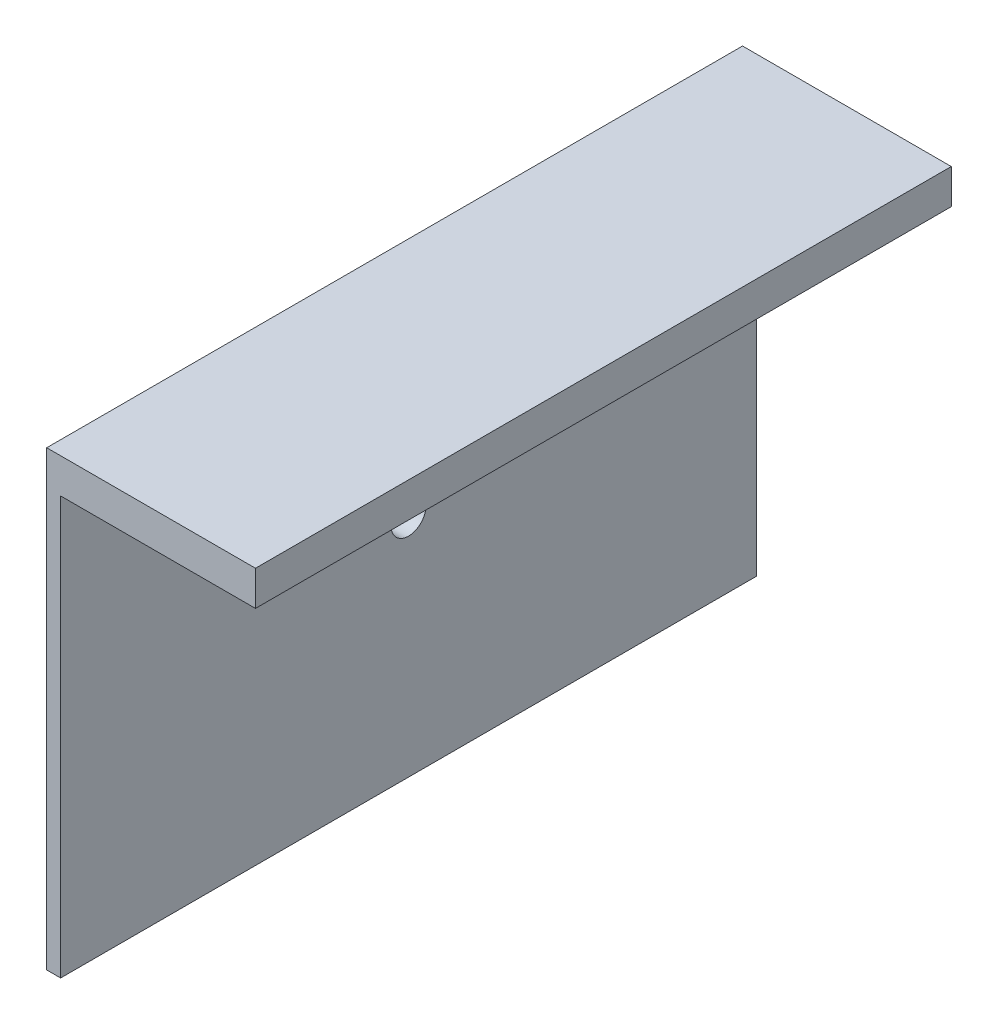
ISO-10303-21;
HEADER;
FILE_DESCRIPTION(('STEP AP214'),'2;1');
FILE_NAME('part.step','',(''),(''),'','','');
FILE_SCHEMA(('AUTOMOTIVE_DESIGN { 1 0 10303 214 1 1 1 1 }'));
ENDSEC;
DATA;
#1=APPLICATION_CONTEXT('core data for automotive mechanical design processes');
#2=APPLICATION_PROTOCOL_DEFINITION('international standard','automotive_design',2000,#1);
#3=PRODUCT_CONTEXT('',#1,'mechanical');
#4=PRODUCT('Part','Part','',(#3));
#5=PRODUCT_RELATED_PRODUCT_CATEGORY('part','',(#4));
#6=PRODUCT_DEFINITION_FORMATION('','',#4);
#7=PRODUCT_DEFINITION_CONTEXT('part definition',#1,'design');
#8=PRODUCT_DEFINITION('design','',#6,#7);
#9=PRODUCT_DEFINITION_SHAPE('','',#8);
#10=(LENGTH_UNIT() NAMED_UNIT(*) SI_UNIT(.MILLI.,.METRE.));
#11=(NAMED_UNIT(*) PLANE_ANGLE_UNIT() SI_UNIT($,.RADIAN.));
#12=(NAMED_UNIT(*) SI_UNIT($,.STERADIAN.) SOLID_ANGLE_UNIT());
#13=UNCERTAINTY_MEASURE_WITH_UNIT(LENGTH_MEASURE(1.E-05),#10,'distance_accuracy_value','');
#14=(GEOMETRIC_REPRESENTATION_CONTEXT(3) GLOBAL_UNCERTAINTY_ASSIGNED_CONTEXT((#13)) GLOBAL_UNIT_ASSIGNED_CONTEXT((#10,
#11,#12)) REPRESENTATION_CONTEXT('',''));
#15=CARTESIAN_POINT('',(0.,0.,0.));
#16=DIRECTION('',(0.,0.,1.));
#17=DIRECTION('',(1.,0.,0.));
#18=AXIS2_PLACEMENT_3D('',#15,#16,#17);
#19=CARTESIAN_POINT('',(2.,0.,0.));
#20=DIRECTION('',(-1.,0.,0.));
#21=DIRECTION('',(0.,0.,1.));
#22=AXIS2_PLACEMENT_3D('',#19,#20,#21);
#23=PLANE('',#22);
#24=CARTESIAN_POINT('',(2.,0.,0.));
#25=DIRECTION('',(1.,0.,0.));
#26=DIRECTION('',(0.,0.,-1.));
#27=AXIS2_PLACEMENT_3D('',#24,#25,#26);
#28=CIRCLE('',#27,2.5);
#29=CARTESIAN_POINT('',(2.,0.,-2.5));
#30=VERTEX_POINT('',#29);
#31=EDGE_CURVE('E95',#30,#30,#28,.T.);
#32=ORIENTED_EDGE('',*,*,#31,.F.);
#33=EDGE_LOOP('',(#32));
#34=FACE_BOUND('',#33,.T.);
#35=DIRECTION('',(0.,0.,-1.));
#36=VECTOR('',#35,1.);
#37=CARTESIAN_POINT('',(2.,27.5,50.));
#38=LINE('',#37,#36);
#39=CARTESIAN_POINT('',(2.,27.5,50.));
#40=VERTEX_POINT('',#39);
#41=CARTESIAN_POINT('',(2.,27.5,-50.));
#42=VERTEX_POINT('',#41);
#43=EDGE_CURVE('E48',#40,#42,#38,.T.);
#44=ORIENTED_EDGE('',*,*,#43,.F.);
#45=DIRECTION('',(0.,-1.,0.));
#46=VECTOR('',#45,1.);
#47=CARTESIAN_POINT('',(2.,-32.5,50.));
#48=LINE('',#47,#46);
#49=CARTESIAN_POINT('',(2.,-32.5,50.));
#50=VERTEX_POINT('',#49);
#51=EDGE_CURVE('E147',#40,#50,#48,.T.);
#52=ORIENTED_EDGE('',*,*,#51,.T.);
#53=DIRECTION('',(0.,0.,-1.));
#54=VECTOR('',#53,1.);
#55=CARTESIAN_POINT('',(2.,-32.5,50.));
#56=LINE('',#55,#54);
#57=CARTESIAN_POINT('',(2.,-32.5,-50.));
#58=VERTEX_POINT('',#57);
#59=EDGE_CURVE('E54',#50,#58,#56,.T.);
#60=ORIENTED_EDGE('',*,*,#59,.T.);
#61=DIRECTION('',(0.,1.,0.));
#62=VECTOR('',#61,1.);
#63=CARTESIAN_POINT('',(2.,-32.5,-50.));
#64=LINE('',#63,#62);
#65=EDGE_CURVE('E83',#58,#42,#64,.T.);
#66=ORIENTED_EDGE('',*,*,#65,.T.);
#67=EDGE_LOOP('',(#44,#52,#60,#66));
#68=FACE_BOUND('',#67,.T.);
#69=ADVANCED_FACE('F33',(#34,#68),#23,.F.);
#70=CARTESIAN_POINT('',(0.,0.,0.));
#71=DIRECTION('',(-1.,0.,0.));
#72=DIRECTION('',(0.,0.,1.));
#73=AXIS2_PLACEMENT_3D('',#70,#71,#72);
#74=PLANE('',#73);
#75=DIRECTION('',(0.,1.,0.));
#76=VECTOR('',#75,1.);
#77=CARTESIAN_POINT('',(0.,-32.5,-50.));
#78=LINE('',#77,#76);
#79=CARTESIAN_POINT('',(0.,-32.5,-50.));
#80=VERTEX_POINT('',#79);
#81=CARTESIAN_POINT('',(0.,32.5,-50.));
#82=VERTEX_POINT('',#81);
#83=EDGE_CURVE('E89',#80,#82,#78,.T.);
#84=ORIENTED_EDGE('',*,*,#83,.F.);
#85=DIRECTION('',(0.,0.,-1.));
#86=VECTOR('',#85,1.);
#87=CARTESIAN_POINT('',(0.,-32.5,50.));
#88=LINE('',#87,#86);
#89=CARTESIAN_POINT('',(0.,-32.5,50.));
#90=VERTEX_POINT('',#89);
#91=EDGE_CURVE('E73',#90,#80,#88,.T.);
#92=ORIENTED_EDGE('',*,*,#91,.F.);
#93=DIRECTION('',(0.,-1.,0.));
#94=VECTOR('',#93,1.);
#95=CARTESIAN_POINT('',(0.,-32.5,50.));
#96=LINE('',#95,#94);
#97=CARTESIAN_POINT('',(0.,32.5,50.));
#98=VERTEX_POINT('',#97);
#99=EDGE_CURVE('E84',#98,#90,#96,.T.);
#100=ORIENTED_EDGE('',*,*,#99,.F.);
#101=DIRECTION('',(0.,0.,1.));
#102=VECTOR('',#101,1.);
#103=CARTESIAN_POINT('',(0.,32.5,50.));
#104=LINE('',#103,#102);
#105=EDGE_CURVE('E94',#82,#98,#104,.T.);
#106=ORIENTED_EDGE('',*,*,#105,.F.);
#107=EDGE_LOOP('',(#84,#92,#100,#106));
#108=FACE_BOUND('',#107,.T.);
#109=CARTESIAN_POINT('',(0.,0.,0.));
#110=DIRECTION('',(1.,0.,0.));
#111=DIRECTION('',(0.,0.,-1.));
#112=AXIS2_PLACEMENT_3D('',#109,#110,#111);
#113=CIRCLE('',#112,2.5);
#114=CARTESIAN_POINT('',(0.,0.,-2.5));
#115=VERTEX_POINT('',#114);
#116=EDGE_CURVE('E99',#115,#115,#113,.T.);
#117=ORIENTED_EDGE('',*,*,#116,.T.);
#118=EDGE_LOOP('',(#117));
#119=FACE_BOUND('',#118,.T.);
#120=ADVANCED_FACE('F92',(#108,#119),#74,.T.);
#121=CARTESIAN_POINT('',(2.,-32.5,-50.));
#122=DIRECTION('',(0.,0.,1.));
#123=DIRECTION('',(1.,0.,0.));
#124=AXIS2_PLACEMENT_3D('',#121,#122,#123);
#125=PLANE('',#124);
#126=ORIENTED_EDGE('',*,*,#83,.T.);
#127=DIRECTION('',(-1.,0.,0.));
#128=VECTOR('',#127,1.);
#129=CARTESIAN_POINT('',(2.,32.5,-50.));
#130=LINE('',#129,#128);
#131=CARTESIAN_POINT('',(30.,32.5,-50.));
#132=VERTEX_POINT('',#131);
#133=EDGE_CURVE('E11',#132,#82,#130,.T.);
#134=ORIENTED_EDGE('',*,*,#133,.F.);
#135=DIRECTION('',(0.,1.,0.));
#136=VECTOR('',#135,1.);
#137=CARTESIAN_POINT('',(30.,27.5,-50.));
#138=LINE('',#137,#136);
#139=CARTESIAN_POINT('',(30.,27.5,-50.));
#140=VERTEX_POINT('',#139);
#141=EDGE_CURVE('E129',#140,#132,#138,.T.);
#142=ORIENTED_EDGE('',*,*,#141,.F.);
#143=DIRECTION('',(-1.,0.,0.));
#144=VECTOR('',#143,1.);
#145=CARTESIAN_POINT('',(30.,27.5,-50.));
#146=LINE('',#145,#144);
#147=EDGE_CURVE('E135',#140,#42,#146,.T.);
#148=ORIENTED_EDGE('',*,*,#147,.T.);
#149=ORIENTED_EDGE('',*,*,#65,.F.);
#150=DIRECTION('',(-1.,0.,0.));
#151=VECTOR('',#150,1.);
#152=CARTESIAN_POINT('',(2.,-32.5,-50.));
#153=LINE('',#152,#151);
#154=EDGE_CURVE('E76',#58,#80,#153,.T.);
#155=ORIENTED_EDGE('',*,*,#154,.T.);
#156=EDGE_LOOP('',(#126,#134,#142,#148,#149,#155));
#157=FACE_BOUND('',#156,.T.);
#158=ADVANCED_FACE('F35',(#157),#125,.F.);
#159=CARTESIAN_POINT('',(2.,32.5,50.));
#160=DIRECTION('',(0.,-1.,0.));
#161=DIRECTION('',(0.,0.,-1.));
#162=AXIS2_PLACEMENT_3D('',#159,#160,#161);
#163=PLANE('',#162);
#164=ORIENTED_EDGE('',*,*,#105,.T.);
#165=DIRECTION('',(-1.,0.,0.));
#166=VECTOR('',#165,1.);
#167=CARTESIAN_POINT('',(2.,32.5,50.));
#168=LINE('',#167,#166);
#169=CARTESIAN_POINT('',(30.,32.5,50.));
#170=VERTEX_POINT('',#169);
#171=EDGE_CURVE('E41',#170,#98,#168,.T.);
#172=ORIENTED_EDGE('',*,*,#171,.F.);
#173=DIRECTION('',(0.,0.,1.));
#174=VECTOR('',#173,1.);
#175=CARTESIAN_POINT('',(30.,32.5,-50.));
#176=LINE('',#175,#174);
#177=EDGE_CURVE('E118',#132,#170,#176,.T.);
#178=ORIENTED_EDGE('',*,*,#177,.F.);
#179=ORIENTED_EDGE('',*,*,#133,.T.);
#180=EDGE_LOOP('',(#164,#172,#178,#179));
#181=FACE_BOUND('',#180,.T.);
#182=ADVANCED_FACE('F117',(#181),#163,.F.);
#183=CARTESIAN_POINT('',(2.,-32.5,50.));
#184=DIRECTION('',(0.,0.,-1.));
#185=DIRECTION('',(-1.,0.,0.));
#186=AXIS2_PLACEMENT_3D('',#183,#184,#185);
#187=PLANE('',#186);
#188=ORIENTED_EDGE('',*,*,#99,.T.);
#189=DIRECTION('',(-1.,0.,0.));
#190=VECTOR('',#189,1.);
#191=CARTESIAN_POINT('',(2.,-32.5,50.));
#192=LINE('',#191,#190);
#193=EDGE_CURVE('E79',#50,#90,#192,.T.);
#194=ORIENTED_EDGE('',*,*,#193,.F.);
#195=ORIENTED_EDGE('',*,*,#51,.F.);
#196=DIRECTION('',(-1.,0.,0.));
#197=VECTOR('',#196,1.);
#198=CARTESIAN_POINT('',(30.,27.5,50.));
#199=LINE('',#198,#197);
#200=CARTESIAN_POINT('',(30.,27.5,50.));
#201=VERTEX_POINT('',#200);
#202=EDGE_CURVE('E137',#201,#40,#199,.T.);
#203=ORIENTED_EDGE('',*,*,#202,.F.);
#204=DIRECTION('',(0.,-1.,0.));
#205=VECTOR('',#204,1.);
#206=CARTESIAN_POINT('',(30.,32.5,50.));
#207=LINE('',#206,#205);
#208=EDGE_CURVE('E113',#170,#201,#207,.T.);
#209=ORIENTED_EDGE('',*,*,#208,.F.);
#210=ORIENTED_EDGE('',*,*,#171,.T.);
#211=EDGE_LOOP('',(#188,#194,#195,#203,#209,#210));
#212=FACE_BOUND('',#211,.T.);
#213=ADVANCED_FACE('F109',(#212),#187,.F.);
#214=CARTESIAN_POINT('',(2.,-32.5,50.));
#215=DIRECTION('',(0.,1.,0.));
#216=DIRECTION('',(0.,0.,1.));
#217=AXIS2_PLACEMENT_3D('',#214,#215,#216);
#218=PLANE('',#217);
#219=ORIENTED_EDGE('',*,*,#91,.T.);
#220=ORIENTED_EDGE('',*,*,#154,.F.);
#221=ORIENTED_EDGE('',*,*,#59,.F.);
#222=ORIENTED_EDGE('',*,*,#193,.T.);
#223=EDGE_LOOP('',(#219,#220,#221,#222));
#224=FACE_BOUND('',#223,.T.);
#225=ADVANCED_FACE('F75',(#224),#218,.F.);
#226=CARTESIAN_POINT('',(2.,0.,0.));
#227=DIRECTION('',(-1.,0.,0.));
#228=DIRECTION('',(0.,0.,1.));
#229=AXIS2_PLACEMENT_3D('',#226,#227,#228);
#230=CYLINDRICAL_SURFACE('',#229,2.5);
#231=ORIENTED_EDGE('',*,*,#31,.T.);
#232=EDGE_LOOP('',(#231));
#233=FACE_BOUND('',#232,.T.);
#234=ORIENTED_EDGE('',*,*,#116,.F.);
#235=EDGE_LOOP('',(#234));
#236=FACE_BOUND('',#235,.T.);
#237=ADVANCED_FACE('F151',(#233,#236),#230,.F.);
#238=CARTESIAN_POINT('',(30.,27.5,50.));
#239=DIRECTION('',(0.,1.,0.));
#240=DIRECTION('',(0.,0.,1.));
#241=AXIS2_PLACEMENT_3D('',#238,#239,#240);
#242=PLANE('',#241);
#243=ORIENTED_EDGE('',*,*,#43,.T.);
#244=ORIENTED_EDGE('',*,*,#147,.F.);
#245=DIRECTION('',(0.,0.,-1.));
#246=VECTOR('',#245,1.);
#247=CARTESIAN_POINT('',(30.,27.5,50.));
#248=LINE('',#247,#246);
#249=EDGE_CURVE('E133',#201,#140,#248,.T.);
#250=ORIENTED_EDGE('',*,*,#249,.F.);
#251=ORIENTED_EDGE('',*,*,#202,.T.);
#252=EDGE_LOOP('',(#243,#244,#250,#251));
#253=FACE_BOUND('',#252,.T.);
#254=ADVANCED_FACE('F149',(#253),#242,.F.);
#255=CARTESIAN_POINT('',(30.,0.,0.));
#256=DIRECTION('',(1.,0.,0.));
#257=DIRECTION('',(0.,0.,-1.));
#258=AXIS2_PLACEMENT_3D('',#255,#256,#257);
#259=PLANE('',#258);
#260=ORIENTED_EDGE('',*,*,#177,.T.);
#261=ORIENTED_EDGE('',*,*,#208,.T.);
#262=ORIENTED_EDGE('',*,*,#249,.T.);
#263=ORIENTED_EDGE('',*,*,#141,.T.);
#264=EDGE_LOOP('',(#260,#261,#262,#263));
#265=FACE_BOUND('',#264,.T.);
#266=ADVANCED_FACE('F131',(#265),#259,.T.);
#267=CLOSED_SHELL('',(#69,#120,#158,#182,#213,#225,#237,#254,#266));
#268=MANIFOLD_SOLID_BREP('B2',#267);
#269=ADVANCED_BREP_SHAPE_REPRESENTATION('',(#18,#268),#14);
#270=SHAPE_DEFINITION_REPRESENTATION(#9,#269);
ENDSEC;
END-ISO-10303-21;
